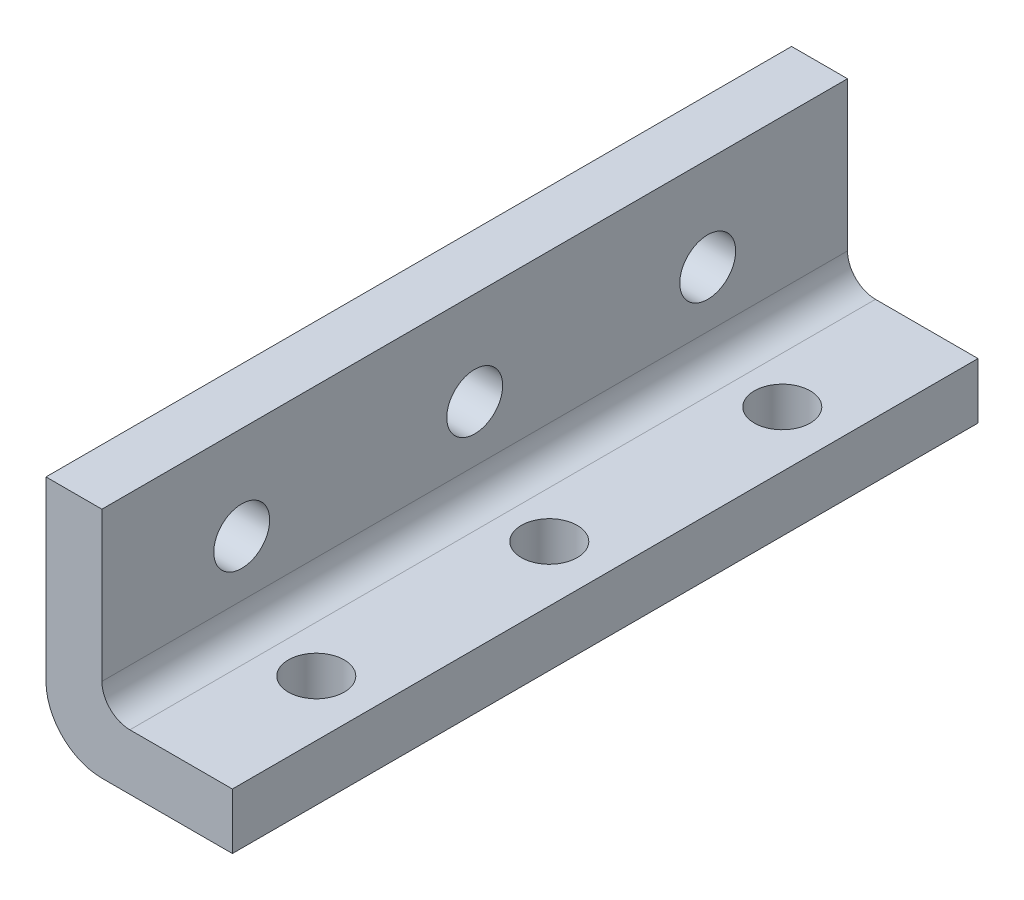
ISO-10303-21;
HEADER;
FILE_DESCRIPTION(('STEP AP214'),'2;1');
FILE_NAME('part.step','',(''),(''),'','','');
FILE_SCHEMA(('AUTOMOTIVE_DESIGN { 1 0 10303 214 1 1 1 1 }'));
ENDSEC;
DATA;
#1=APPLICATION_CONTEXT('core data for automotive mechanical design processes');
#2=APPLICATION_PROTOCOL_DEFINITION('international standard','automotive_design',2000,#1);
#3=PRODUCT_CONTEXT('',#1,'mechanical');
#4=PRODUCT('Part','Part','',(#3));
#5=PRODUCT_RELATED_PRODUCT_CATEGORY('part','',(#4));
#6=PRODUCT_DEFINITION_FORMATION('','',#4);
#7=PRODUCT_DEFINITION_CONTEXT('part definition',#1,'design');
#8=PRODUCT_DEFINITION('design','',#6,#7);
#9=PRODUCT_DEFINITION_SHAPE('','',#8);
#10=(LENGTH_UNIT() NAMED_UNIT(*) SI_UNIT(.MILLI.,.METRE.));
#11=(NAMED_UNIT(*) PLANE_ANGLE_UNIT() SI_UNIT($,.RADIAN.));
#12=(NAMED_UNIT(*) SI_UNIT($,.STERADIAN.) SOLID_ANGLE_UNIT());
#13=UNCERTAINTY_MEASURE_WITH_UNIT(LENGTH_MEASURE(1.E-05),#10,'distance_accuracy_value','');
#14=(GEOMETRIC_REPRESENTATION_CONTEXT(3) GLOBAL_UNCERTAINTY_ASSIGNED_CONTEXT((#13)) GLOBAL_UNIT_ASSIGNED_CONTEXT((#10,
#11,#12)) REPRESENTATION_CONTEXT('',''));
#15=CARTESIAN_POINT('',(0.,0.,0.));
#16=DIRECTION('',(0.,0.,1.));
#17=DIRECTION('',(1.,0.,0.));
#18=AXIS2_PLACEMENT_3D('',#15,#16,#17);
#19=CARTESIAN_POINT('',(0.,-25.,80.));
#20=DIRECTION('',(1.,0.,0.));
#21=DIRECTION('',(0.,0.,-1.));
#22=AXIS2_PLACEMENT_3D('',#19,#20,#21);
#23=PLANE('',#22);
#24=CARTESIAN_POINT('',(0.,-10.,65.));
#25=DIRECTION('',(1.,0.,0.));
#26=DIRECTION('',(0.,1.,0.));
#27=AXIS2_PLACEMENT_3D('',#24,#25,#26);
#28=CIRCLE('',#27,3.);
#29=CARTESIAN_POINT('',(0.,-7.,65.));
#30=VERTEX_POINT('',#29);
#31=EDGE_CURVE('E153',#30,#30,#28,.T.);
#32=ORIENTED_EDGE('',*,*,#31,.T.);
#33=EDGE_LOOP('',(#32));
#34=FACE_BOUND('',#33,.T.);
#35=CARTESIAN_POINT('',(0.,-10.,15.));
#36=DIRECTION('',(1.,0.,0.));
#37=DIRECTION('',(0.,1.,0.));
#38=AXIS2_PLACEMENT_3D('',#35,#36,#37);
#39=CIRCLE('',#38,3.);
#40=CARTESIAN_POINT('',(0.,-7.,15.));
#41=VERTEX_POINT('',#40);
#42=EDGE_CURVE('E214',#41,#41,#39,.T.);
#43=ORIENTED_EDGE('',*,*,#42,.T.);
#44=EDGE_LOOP('',(#43));
#45=FACE_BOUND('',#44,.T.);
#46=CARTESIAN_POINT('',(0.,-10.,40.));
#47=DIRECTION('',(1.,0.,0.));
#48=DIRECTION('',(0.,1.,0.));
#49=AXIS2_PLACEMENT_3D('',#46,#47,#48);
#50=CIRCLE('',#49,3.);
#51=CARTESIAN_POINT('',(0.,-7.,40.));
#52=VERTEX_POINT('',#51);
#53=EDGE_CURVE('E205',#52,#52,#50,.T.);
#54=ORIENTED_EDGE('',*,*,#53,.T.);
#55=EDGE_LOOP('',(#54));
#56=FACE_BOUND('',#55,.T.);
#57=DIRECTION('',(0.,-1.,0.));
#58=VECTOR('',#57,1.);
#59=CARTESIAN_POINT('',(0.,-25.,0.));
#60=LINE('',#59,#58);
#61=CARTESIAN_POINT('',(0.,0.,0.));
#62=VERTEX_POINT('',#61);
#63=CARTESIAN_POINT('',(0.,-19.,0.));
#64=VERTEX_POINT('',#63);
#65=EDGE_CURVE('E149',#62,#64,#60,.T.);
#66=ORIENTED_EDGE('',*,*,#65,.T.);
#67=DIRECTION('',(0.,0.,-1.));
#68=VECTOR('',#67,1.);
#69=CARTESIAN_POINT('',(0.,-19.,80.));
#70=LINE('',#69,#68);
#71=CARTESIAN_POINT('',(0.,-19.,80.));
#72=VERTEX_POINT('',#71);
#73=EDGE_CURVE('E180',#64,#72,#70,.F.);
#74=ORIENTED_EDGE('',*,*,#73,.T.);
#75=DIRECTION('',(0.,-1.,0.));
#76=VECTOR('',#75,1.);
#77=CARTESIAN_POINT('',(0.,-25.,80.));
#78=LINE('',#77,#76);
#79=CARTESIAN_POINT('',(0.,0.,80.));
#80=VERTEX_POINT('',#79);
#81=EDGE_CURVE('E118',#80,#72,#78,.T.);
#82=ORIENTED_EDGE('',*,*,#81,.F.);
#83=DIRECTION('',(0.,0.,-1.));
#84=VECTOR('',#83,1.);
#85=CARTESIAN_POINT('',(0.,0.,80.));
#86=LINE('',#85,#84);
#87=EDGE_CURVE('E148',#80,#62,#86,.T.);
#88=ORIENTED_EDGE('',*,*,#87,.T.);
#89=EDGE_LOOP('',(#66,#74,#82,#88));
#90=FACE_BOUND('',#89,.T.);
#91=ADVANCED_FACE('F41',(#34,#45,#56,#90),#23,.F.);
#92=CARTESIAN_POINT('',(20.,-25.,80.));
#93=DIRECTION('',(0.,1.,0.));
#94=DIRECTION('',(0.,0.,1.));
#95=AXIS2_PLACEMENT_3D('',#92,#93,#94);
#96=PLANE('',#95);
#97=CARTESIAN_POINT('',(14.,-25.,15.));
#98=DIRECTION('',(0.,1.,0.));
#99=DIRECTION('',(0.,0.,1.));
#100=AXIS2_PLACEMENT_3D('',#97,#98,#99);
#101=CIRCLE('',#100,3.);
#102=CARTESIAN_POINT('',(14.,-25.,18.));
#103=VERTEX_POINT('',#102);
#104=EDGE_CURVE('E210',#103,#103,#101,.T.);
#105=ORIENTED_EDGE('',*,*,#104,.T.);
#106=EDGE_LOOP('',(#105));
#107=FACE_BOUND('',#106,.T.);
#108=CARTESIAN_POINT('',(14.,-25.,65.));
#109=DIRECTION('',(0.,1.,0.));
#110=DIRECTION('',(0.,0.,1.));
#111=AXIS2_PLACEMENT_3D('',#108,#109,#110);
#112=CIRCLE('',#111,3.00000000000001);
#113=CARTESIAN_POINT('',(14.,-25.,68.));
#114=VERTEX_POINT('',#113);
#115=EDGE_CURVE('E237',#114,#114,#112,.T.);
#116=ORIENTED_EDGE('',*,*,#115,.T.);
#117=EDGE_LOOP('',(#116));
#118=FACE_BOUND('',#117,.T.);
#119=CARTESIAN_POINT('',(14.,-25.,40.));
#120=DIRECTION('',(0.,1.,0.));
#121=DIRECTION('',(0.,0.,1.));
#122=AXIS2_PLACEMENT_3D('',#119,#120,#121);
#123=CIRCLE('',#122,3.00000000000001);
#124=CARTESIAN_POINT('',(14.,-25.,43.));
#125=VERTEX_POINT('',#124);
#126=EDGE_CURVE('E229',#125,#125,#123,.T.);
#127=ORIENTED_EDGE('',*,*,#126,.T.);
#128=EDGE_LOOP('',(#127));
#129=FACE_BOUND('',#128,.T.);
#130=DIRECTION('',(1.,0.,0.));
#131=VECTOR('',#130,1.);
#132=CARTESIAN_POINT('',(20.,-25.,80.));
#133=LINE('',#132,#131);
#134=CARTESIAN_POINT('',(6.,-25.,80.));
#135=VERTEX_POINT('',#134);
#136=CARTESIAN_POINT('',(20.,-25.,80.));
#137=VERTEX_POINT('',#136);
#138=EDGE_CURVE('E105',#135,#137,#133,.T.);
#139=ORIENTED_EDGE('',*,*,#138,.F.);
#140=DIRECTION('',(0.,0.,-1.));
#141=VECTOR('',#140,1.);
#142=CARTESIAN_POINT('',(6.,-25.,80.));
#143=LINE('',#142,#141);
#144=CARTESIAN_POINT('',(6.,-25.,0.));
#145=VERTEX_POINT('',#144);
#146=EDGE_CURVE('E128',#135,#145,#143,.T.);
#147=ORIENTED_EDGE('',*,*,#146,.T.);
#148=DIRECTION('',(1.,0.,0.));
#149=VECTOR('',#148,1.);
#150=CARTESIAN_POINT('',(20.,-25.,0.));
#151=LINE('',#150,#149);
#152=CARTESIAN_POINT('',(20.,-25.,0.));
#153=VERTEX_POINT('',#152);
#154=EDGE_CURVE('E124',#145,#153,#151,.T.);
#155=ORIENTED_EDGE('',*,*,#154,.T.);
#156=DIRECTION('',(0.,0.,-1.));
#157=VECTOR('',#156,1.);
#158=CARTESIAN_POINT('',(20.,-25.,80.));
#159=LINE('',#158,#157);
#160=EDGE_CURVE('E121',#137,#153,#159,.T.);
#161=ORIENTED_EDGE('',*,*,#160,.F.);
#162=EDGE_LOOP('',(#139,#147,#155,#161));
#163=FACE_BOUND('',#162,.T.);
#164=ADVANCED_FACE('F122',(#107,#118,#129,#163),#96,.F.);
#165=CARTESIAN_POINT('',(20.,-19.,80.));
#166=DIRECTION('',(-1.,0.,0.));
#167=DIRECTION('',(0.,-1.,0.));
#168=AXIS2_PLACEMENT_3D('',#165,#166,#167);
#169=PLANE('',#168);
#170=DIRECTION('',(0.,1.,0.));
#171=VECTOR('',#170,1.);
#172=CARTESIAN_POINT('',(20.,-19.,0.));
#173=LINE('',#172,#171);
#174=CARTESIAN_POINT('',(20.,-19.,0.));
#175=VERTEX_POINT('',#174);
#176=EDGE_CURVE('E156',#153,#175,#173,.T.);
#177=ORIENTED_EDGE('',*,*,#176,.T.);
#178=DIRECTION('',(0.,0.,-1.));
#179=VECTOR('',#178,1.);
#180=CARTESIAN_POINT('',(20.,-19.,80.));
#181=LINE('',#180,#179);
#182=CARTESIAN_POINT('',(20.,-19.,80.));
#183=VERTEX_POINT('',#182);
#184=EDGE_CURVE('E129',#183,#175,#181,.T.);
#185=ORIENTED_EDGE('',*,*,#184,.F.);
#186=DIRECTION('',(0.,1.,0.));
#187=VECTOR('',#186,1.);
#188=CARTESIAN_POINT('',(20.,-19.,80.));
#189=LINE('',#188,#187);
#190=EDGE_CURVE('E110',#137,#183,#189,.T.);
#191=ORIENTED_EDGE('',*,*,#190,.F.);
#192=ORIENTED_EDGE('',*,*,#160,.T.);
#193=EDGE_LOOP('',(#177,#185,#191,#192));
#194=FACE_BOUND('',#193,.T.);
#195=ADVANCED_FACE('F131',(#194),#169,.F.);
#196=CARTESIAN_POINT('',(6.,-19.,80.));
#197=DIRECTION('',(0.,-1.,0.));
#198=DIRECTION('',(0.,0.,-1.));
#199=AXIS2_PLACEMENT_3D('',#196,#197,#198);
#200=PLANE('',#199);
#201=CARTESIAN_POINT('',(14.,-19.,15.));
#202=DIRECTION('',(0.,1.,0.));
#203=DIRECTION('',(0.,0.,1.));
#204=AXIS2_PLACEMENT_3D('',#201,#202,#203);
#205=CIRCLE('',#204,3.);
#206=CARTESIAN_POINT('',(14.,-19.,18.));
#207=VERTEX_POINT('',#206);
#208=EDGE_CURVE('E245',#207,#207,#205,.T.);
#209=ORIENTED_EDGE('',*,*,#208,.F.);
#210=EDGE_LOOP('',(#209));
#211=FACE_BOUND('',#210,.T.);
#212=CARTESIAN_POINT('',(14.,-19.,65.));
#213=DIRECTION('',(0.,1.,0.));
#214=DIRECTION('',(0.,0.,1.));
#215=AXIS2_PLACEMENT_3D('',#212,#213,#214);
#216=CIRCLE('',#215,3.00000000000001);
#217=CARTESIAN_POINT('',(14.,-19.,68.));
#218=VERTEX_POINT('',#217);
#219=EDGE_CURVE('E241',#218,#218,#216,.T.);
#220=ORIENTED_EDGE('',*,*,#219,.F.);
#221=EDGE_LOOP('',(#220));
#222=FACE_BOUND('',#221,.T.);
#223=CARTESIAN_POINT('',(14.,-19.,40.));
#224=DIRECTION('',(0.,1.,0.));
#225=DIRECTION('',(0.,0.,1.));
#226=AXIS2_PLACEMENT_3D('',#223,#224,#225);
#227=CIRCLE('',#226,3.00000000000001);
#228=CARTESIAN_POINT('',(14.,-19.,43.));
#229=VERTEX_POINT('',#228);
#230=EDGE_CURVE('E233',#229,#229,#227,.T.);
#231=ORIENTED_EDGE('',*,*,#230,.F.);
#232=EDGE_LOOP('',(#231));
#233=FACE_BOUND('',#232,.T.);
#234=DIRECTION('',(-1.,0.,0.));
#235=VECTOR('',#234,1.);
#236=CARTESIAN_POINT('',(6.,-19.,0.));
#237=LINE('',#236,#235);
#238=CARTESIAN_POINT('',(9.,-19.,0.));
#239=VERTEX_POINT('',#238);
#240=EDGE_CURVE('E159',#175,#239,#237,.T.);
#241=ORIENTED_EDGE('',*,*,#240,.T.);
#242=DIRECTION('',(0.,0.,-1.));
#243=VECTOR('',#242,1.);
#244=CARTESIAN_POINT('',(9.,-19.,80.));
#245=LINE('',#244,#243);
#246=CARTESIAN_POINT('',(9.,-19.,80.));
#247=VERTEX_POINT('',#246);
#248=EDGE_CURVE('E56',#239,#247,#245,.F.);
#249=ORIENTED_EDGE('',*,*,#248,.T.);
#250=DIRECTION('',(-1.,0.,0.));
#251=VECTOR('',#250,1.);
#252=CARTESIAN_POINT('',(6.,-19.,80.));
#253=LINE('',#252,#251);
#254=EDGE_CURVE('E134',#183,#247,#253,.T.);
#255=ORIENTED_EDGE('',*,*,#254,.F.);
#256=ORIENTED_EDGE('',*,*,#184,.T.);
#257=EDGE_LOOP('',(#241,#249,#255,#256));
#258=FACE_BOUND('',#257,.T.);
#259=ADVANCED_FACE('F264',(#211,#222,#233,#258),#200,.F.);
#260=CARTESIAN_POINT('',(6.,0.,80.));
#261=DIRECTION('',(-1.,0.,0.));
#262=DIRECTION('',(0.,-1.,0.));
#263=AXIS2_PLACEMENT_3D('',#260,#261,#262);
#264=PLANE('',#263);
#265=CARTESIAN_POINT('',(6.,-10.,65.));
#266=DIRECTION('',(1.,0.,0.));
#267=DIRECTION('',(0.,1.,0.));
#268=AXIS2_PLACEMENT_3D('',#265,#266,#267);
#269=CIRCLE('',#268,3.);
#270=CARTESIAN_POINT('',(6.,-7.,65.));
#271=VERTEX_POINT('',#270);
#272=EDGE_CURVE('E222',#271,#271,#269,.T.);
#273=ORIENTED_EDGE('',*,*,#272,.F.);
#274=EDGE_LOOP('',(#273));
#275=FACE_BOUND('',#274,.T.);
#276=CARTESIAN_POINT('',(6.,-10.,15.));
#277=DIRECTION('',(1.,0.,0.));
#278=DIRECTION('',(0.,1.,0.));
#279=AXIS2_PLACEMENT_3D('',#276,#277,#278);
#280=CIRCLE('',#279,3.);
#281=CARTESIAN_POINT('',(6.,-7.,15.));
#282=VERTEX_POINT('',#281);
#283=EDGE_CURVE('E218',#282,#282,#280,.T.);
#284=ORIENTED_EDGE('',*,*,#283,.F.);
#285=EDGE_LOOP('',(#284));
#286=FACE_BOUND('',#285,.T.);
#287=CARTESIAN_POINT('',(6.,-10.,40.));
#288=DIRECTION('',(1.,0.,0.));
#289=DIRECTION('',(0.,1.,0.));
#290=AXIS2_PLACEMENT_3D('',#287,#288,#289);
#291=CIRCLE('',#290,3.);
#292=CARTESIAN_POINT('',(6.,-7.,40.));
#293=VERTEX_POINT('',#292);
#294=EDGE_CURVE('E209',#293,#293,#291,.T.);
#295=ORIENTED_EDGE('',*,*,#294,.F.);
#296=EDGE_LOOP('',(#295));
#297=FACE_BOUND('',#296,.T.);
#298=DIRECTION('',(0.,1.,0.));
#299=VECTOR('',#298,1.);
#300=CARTESIAN_POINT('',(6.,0.,80.));
#301=LINE('',#300,#299);
#302=CARTESIAN_POINT('',(6.,-16.,80.));
#303=VERTEX_POINT('',#302);
#304=CARTESIAN_POINT('',(6.,0.,80.));
#305=VERTEX_POINT('',#304);
#306=EDGE_CURVE('E139',#303,#305,#301,.T.);
#307=ORIENTED_EDGE('',*,*,#306,.F.);
#308=DIRECTION('',(0.,0.,-1.));
#309=VECTOR('',#308,1.);
#310=CARTESIAN_POINT('',(6.,-16.,0.));
#311=LINE('',#310,#309);
#312=CARTESIAN_POINT('',(6.,-16.,0.));
#313=VERTEX_POINT('',#312);
#314=EDGE_CURVE('E183',#303,#313,#311,.T.);
#315=ORIENTED_EDGE('',*,*,#314,.T.);
#316=DIRECTION('',(0.,1.,0.));
#317=VECTOR('',#316,1.);
#318=CARTESIAN_POINT('',(6.,0.,0.));
#319=LINE('',#318,#317);
#320=CARTESIAN_POINT('',(6.,0.,0.));
#321=VERTEX_POINT('',#320);
#322=EDGE_CURVE('E162',#313,#321,#319,.T.);
#323=ORIENTED_EDGE('',*,*,#322,.T.);
#324=DIRECTION('',(0.,0.,-1.));
#325=VECTOR('',#324,1.);
#326=CARTESIAN_POINT('',(6.,0.,80.));
#327=LINE('',#326,#325);
#328=EDGE_CURVE('E171',#305,#321,#327,.T.);
#329=ORIENTED_EDGE('',*,*,#328,.F.);
#330=EDGE_LOOP('',(#307,#315,#323,#329));
#331=FACE_BOUND('',#330,.T.);
#332=ADVANCED_FACE('F189',(#275,#286,#297,#331),#264,.F.);
#333=CARTESIAN_POINT('',(0.,0.,80.));
#334=DIRECTION('',(0.,-1.,0.));
#335=DIRECTION('',(0.,0.,-1.));
#336=AXIS2_PLACEMENT_3D('',#333,#334,#335);
#337=PLANE('',#336);
#338=DIRECTION('',(-1.,0.,0.));
#339=VECTOR('',#338,1.);
#340=CARTESIAN_POINT('',(0.,0.,0.));
#341=LINE('',#340,#339);
#342=EDGE_CURVE('E165',#321,#62,#341,.T.);
#343=ORIENTED_EDGE('',*,*,#342,.T.);
#344=ORIENTED_EDGE('',*,*,#87,.F.);
#345=DIRECTION('',(-1.,0.,0.));
#346=VECTOR('',#345,1.);
#347=CARTESIAN_POINT('',(0.,0.,80.));
#348=LINE('',#347,#346);
#349=EDGE_CURVE('E145',#305,#80,#348,.T.);
#350=ORIENTED_EDGE('',*,*,#349,.F.);
#351=ORIENTED_EDGE('',*,*,#328,.T.);
#352=EDGE_LOOP('',(#343,#344,#350,#351));
#353=FACE_BOUND('',#352,.T.);
#354=ADVANCED_FACE('F198',(#353),#337,.F.);
#355=CARTESIAN_POINT('',(0.,0.,80.));
#356=DIRECTION('',(0.,0.,-1.));
#357=DIRECTION('',(-1.,0.,0.));
#358=AXIS2_PLACEMENT_3D('',#355,#356,#357);
#359=PLANE('',#358);
#360=ORIENTED_EDGE('',*,*,#81,.T.);
#361=CARTESIAN_POINT('',(6.,-19.,80.));
#362=DIRECTION('',(0.,0.,-1.));
#363=DIRECTION('',(-1.,0.,0.));
#364=AXIS2_PLACEMENT_3D('',#361,#362,#363);
#365=CIRCLE('',#364,6.);
#366=EDGE_CURVE('E113',#72,#135,#365,.F.);
#367=ORIENTED_EDGE('',*,*,#366,.T.);
#368=ORIENTED_EDGE('',*,*,#138,.T.);
#369=ORIENTED_EDGE('',*,*,#190,.T.);
#370=ORIENTED_EDGE('',*,*,#254,.T.);
#371=CARTESIAN_POINT('',(9.,-16.,80.));
#372=DIRECTION('',(0.,0.,-1.));
#373=DIRECTION('',(-1.,0.,0.));
#374=AXIS2_PLACEMENT_3D('',#371,#372,#373);
#375=CIRCLE('',#374,3.);
#376=EDGE_CURVE('E11',#247,#303,#375,.T.);
#377=ORIENTED_EDGE('',*,*,#376,.T.);
#378=ORIENTED_EDGE('',*,*,#306,.T.);
#379=ORIENTED_EDGE('',*,*,#349,.T.);
#380=EDGE_LOOP('',(#360,#367,#368,#369,#370,#377,#378,#379));
#381=FACE_BOUND('',#380,.T.);
#382=ADVANCED_FACE('F108',(#381),#359,.F.);
#383=CARTESIAN_POINT('',(0.,0.,0.));
#384=DIRECTION('',(0.,0.,-1.));
#385=DIRECTION('',(-1.,0.,0.));
#386=AXIS2_PLACEMENT_3D('',#383,#384,#385);
#387=PLANE('',#386);
#388=ORIENTED_EDGE('',*,*,#154,.F.);
#389=CARTESIAN_POINT('',(6.,-19.,0.));
#390=DIRECTION('',(0.,0.,-1.));
#391=DIRECTION('',(-1.,0.,0.));
#392=AXIS2_PLACEMENT_3D('',#389,#390,#391);
#393=CIRCLE('',#392,6.);
#394=EDGE_CURVE('E178',#145,#64,#393,.T.);
#395=ORIENTED_EDGE('',*,*,#394,.T.);
#396=ORIENTED_EDGE('',*,*,#65,.F.);
#397=ORIENTED_EDGE('',*,*,#342,.F.);
#398=ORIENTED_EDGE('',*,*,#322,.F.);
#399=CARTESIAN_POINT('',(9.,-16.,0.));
#400=DIRECTION('',(0.,0.,-1.));
#401=DIRECTION('',(-1.,0.,0.));
#402=AXIS2_PLACEMENT_3D('',#399,#400,#401);
#403=CIRCLE('',#402,3.);
#404=EDGE_CURVE('E49',#313,#239,#403,.F.);
#405=ORIENTED_EDGE('',*,*,#404,.T.);
#406=ORIENTED_EDGE('',*,*,#240,.F.);
#407=ORIENTED_EDGE('',*,*,#176,.F.);
#408=EDGE_LOOP('',(#388,#395,#396,#397,#398,#405,#406,#407));
#409=FACE_BOUND('',#408,.T.);
#410=ADVANCED_FACE('F194',(#409),#387,.T.);
#411=CARTESIAN_POINT('',(0.,-10.,40.));
#412=DIRECTION('',(1.,0.,0.));
#413=DIRECTION('',(0.,1.,0.));
#414=AXIS2_PLACEMENT_3D('',#411,#412,#413);
#415=CYLINDRICAL_SURFACE('',#414,3.);
#416=ORIENTED_EDGE('',*,*,#53,.F.);
#417=EDGE_LOOP('',(#416));
#418=FACE_BOUND('',#417,.T.);
#419=ORIENTED_EDGE('',*,*,#294,.T.);
#420=EDGE_LOOP('',(#419));
#421=FACE_BOUND('',#420,.T.);
#422=ADVANCED_FACE('F295',(#418,#421),#415,.F.);
#423=CARTESIAN_POINT('',(0.,-10.,15.));
#424=DIRECTION('',(1.,0.,0.));
#425=DIRECTION('',(0.,1.,0.));
#426=AXIS2_PLACEMENT_3D('',#423,#424,#425);
#427=CYLINDRICAL_SURFACE('',#426,3.);
#428=ORIENTED_EDGE('',*,*,#42,.F.);
#429=EDGE_LOOP('',(#428));
#430=FACE_BOUND('',#429,.T.);
#431=ORIENTED_EDGE('',*,*,#283,.T.);
#432=EDGE_LOOP('',(#431));
#433=FACE_BOUND('',#432,.T.);
#434=ADVANCED_FACE('F300',(#430,#433),#427,.F.);
#435=CARTESIAN_POINT('',(0.,-10.,65.));
#436=DIRECTION('',(1.,0.,0.));
#437=DIRECTION('',(0.,1.,0.));
#438=AXIS2_PLACEMENT_3D('',#435,#436,#437);
#439=CYLINDRICAL_SURFACE('',#438,3.);
#440=ORIENTED_EDGE('',*,*,#31,.F.);
#441=EDGE_LOOP('',(#440));
#442=FACE_BOUND('',#441,.T.);
#443=ORIENTED_EDGE('',*,*,#272,.T.);
#444=EDGE_LOOP('',(#443));
#445=FACE_BOUND('',#444,.T.);
#446=ADVANCED_FACE('F304',(#442,#445),#439,.F.);
#447=CARTESIAN_POINT('',(14.,-25.,40.));
#448=DIRECTION('',(0.,1.,0.));
#449=DIRECTION('',(0.,0.,1.));
#450=AXIS2_PLACEMENT_3D('',#447,#448,#449);
#451=CYLINDRICAL_SURFACE('',#450,3.00000000000001);
#452=ORIENTED_EDGE('',*,*,#126,.F.);
#453=EDGE_LOOP('',(#452));
#454=FACE_BOUND('',#453,.T.);
#455=ORIENTED_EDGE('',*,*,#230,.T.);
#456=EDGE_LOOP('',(#455));
#457=FACE_BOUND('',#456,.T.);
#458=ADVANCED_FACE('F308',(#454,#457),#451,.F.);
#459=CARTESIAN_POINT('',(14.,-25.,65.));
#460=DIRECTION('',(0.,1.,0.));
#461=DIRECTION('',(0.,0.,1.));
#462=AXIS2_PLACEMENT_3D('',#459,#460,#461);
#463=CYLINDRICAL_SURFACE('',#462,3.00000000000001);
#464=ORIENTED_EDGE('',*,*,#115,.F.);
#465=EDGE_LOOP('',(#464));
#466=FACE_BOUND('',#465,.T.);
#467=ORIENTED_EDGE('',*,*,#219,.T.);
#468=EDGE_LOOP('',(#467));
#469=FACE_BOUND('',#468,.T.);
#470=ADVANCED_FACE('F260',(#466,#469),#463,.F.);
#471=CARTESIAN_POINT('',(14.,-25.,15.));
#472=DIRECTION('',(0.,1.,0.));
#473=DIRECTION('',(0.,0.,1.));
#474=AXIS2_PLACEMENT_3D('',#471,#472,#473);
#475=CYLINDRICAL_SURFACE('',#474,3.);
#476=ORIENTED_EDGE('',*,*,#104,.F.);
#477=EDGE_LOOP('',(#476));
#478=FACE_BOUND('',#477,.T.);
#479=ORIENTED_EDGE('',*,*,#208,.T.);
#480=EDGE_LOOP('',(#479));
#481=FACE_BOUND('',#480,.T.);
#482=ADVANCED_FACE('F256',(#478,#481),#475,.F.);
#483=CARTESIAN_POINT('',(6.,-19.,80.));
#484=DIRECTION('',(0.,0.,-1.));
#485=DIRECTION('',(-1.,0.,0.));
#486=AXIS2_PLACEMENT_3D('',#483,#484,#485);
#487=CYLINDRICAL_SURFACE('',#486,6.);
#488=ORIENTED_EDGE('',*,*,#366,.F.);
#489=ORIENTED_EDGE('',*,*,#73,.F.);
#490=ORIENTED_EDGE('',*,*,#394,.F.);
#491=ORIENTED_EDGE('',*,*,#146,.F.);
#492=EDGE_LOOP('',(#488,#489,#490,#491));
#493=FACE_BOUND('',#492,.T.);
#494=ADVANCED_FACE('F259',(#493),#487,.T.);
#495=CARTESIAN_POINT('',(9.,-16.,80.));
#496=DIRECTION('',(0.,0.,1.));
#497=DIRECTION('',(1.,0.,0.));
#498=AXIS2_PLACEMENT_3D('',#495,#496,#497);
#499=CYLINDRICAL_SURFACE('',#498,3.);
#500=ORIENTED_EDGE('',*,*,#376,.F.);
#501=ORIENTED_EDGE('',*,*,#248,.F.);
#502=ORIENTED_EDGE('',*,*,#404,.F.);
#503=ORIENTED_EDGE('',*,*,#314,.F.);
#504=EDGE_LOOP('',(#500,#501,#502,#503));
#505=FACE_BOUND('',#504,.T.);
#506=ADVANCED_FACE('F43',(#505),#499,.F.);
#507=CLOSED_SHELL('',(#91,#164,#195,#259,#332,#354,#382,#410,#422,#434,#446,#458,#470,#482,#494,#506));
#508=MANIFOLD_SOLID_BREP('B2',#507);
#509=ADVANCED_BREP_SHAPE_REPRESENTATION('',(#18,#508),#14);
#510=SHAPE_DEFINITION_REPRESENTATION(#9,#509);
ENDSEC;
END-ISO-10303-21;
